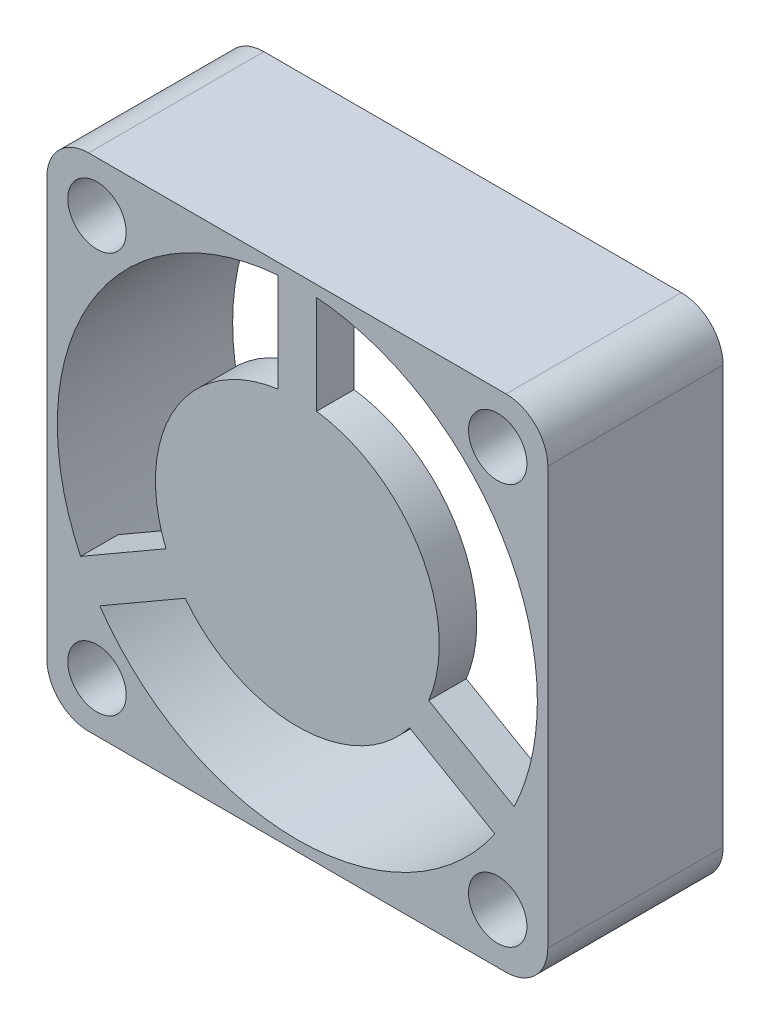
ISO-10303-21;
HEADER;
FILE_DESCRIPTION(('STEP AP214'),'2;1');
FILE_NAME('part.step','',(''),(''),'','','');
FILE_SCHEMA(('AUTOMOTIVE_DESIGN { 1 0 10303 214 1 1 1 1 }'));
ENDSEC;
DATA;
#1=APPLICATION_CONTEXT('core data for automotive mechanical design processes');
#2=APPLICATION_PROTOCOL_DEFINITION('international standard','automotive_design',2000,#1);
#3=PRODUCT_CONTEXT('',#1,'mechanical');
#4=PRODUCT('Part','Part','',(#3));
#5=PRODUCT_RELATED_PRODUCT_CATEGORY('part','',(#4));
#6=PRODUCT_DEFINITION_FORMATION('','',#4);
#7=PRODUCT_DEFINITION_CONTEXT('part definition',#1,'design');
#8=PRODUCT_DEFINITION('design','',#6,#7);
#9=PRODUCT_DEFINITION_SHAPE('','',#8);
#10=(LENGTH_UNIT() NAMED_UNIT(*) SI_UNIT(.MILLI.,.METRE.));
#11=(NAMED_UNIT(*) PLANE_ANGLE_UNIT() SI_UNIT($,.RADIAN.));
#12=(NAMED_UNIT(*) SI_UNIT($,.STERADIAN.) SOLID_ANGLE_UNIT());
#13=UNCERTAINTY_MEASURE_WITH_UNIT(LENGTH_MEASURE(1.E-05),#10,'distance_accuracy_value','');
#14=(GEOMETRIC_REPRESENTATION_CONTEXT(3) GLOBAL_UNCERTAINTY_ASSIGNED_CONTEXT((#13)) GLOBAL_UNIT_ASSIGNED_CONTEXT((#10,
#11,#12)) REPRESENTATION_CONTEXT('',''));
#15=CARTESIAN_POINT('',(0.,0.,0.));
#16=DIRECTION('',(0.,0.,1.));
#17=DIRECTION('',(1.,0.,0.));
#18=AXIS2_PLACEMENT_3D('',#15,#16,#17);
#19=CARTESIAN_POINT('',(0.,-15.5,3.31722847279162));
#20=DIRECTION('',(0.,-1.,0.));
#21=DIRECTION('',(0.,0.,-1.));
#22=AXIS2_PLACEMENT_3D('',#19,#20,#21);
#23=PLANE('',#22);
#24=DIRECTION('',(-1.,0.,0.));
#25=VECTOR('',#24,1.);
#26=CARTESIAN_POINT('',(-1.08409284439404,-15.5,5.9065637178719));
#27=LINE('',#26,#25);
#28=CARTESIAN_POINT('',(-0.473337044240907,-15.5,5.9065637178719));
#29=VERTEX_POINT('',#28);
#30=CARTESIAN_POINT('',(-1.69484864454716,-15.5,5.9065637178719));
#31=VERTEX_POINT('',#30);
#32=EDGE_CURVE('E225',#29,#31,#27,.T.);
#33=ORIENTED_EDGE('',*,*,#32,.F.);
#34=DIRECTION('',(0.,0.,1.));
#35=VECTOR('',#34,1.);
#36=CARTESIAN_POINT('',(-0.473337044240907,-15.5,3.89106664806604));
#37=LINE('',#36,#35);
#38=CARTESIAN_POINT('',(-0.473337044240907,-15.5,1.87556957826019));
#39=VERTEX_POINT('',#38);
#40=EDGE_CURVE('E204',#39,#29,#37,.T.);
#41=ORIENTED_EDGE('',*,*,#40,.F.);
#42=DIRECTION('',(-1.,0.,0.));
#43=VECTOR('',#42,1.);
#44=CARTESIAN_POINT('',(0.,-15.5,1.87556957826019));
#45=LINE('',#44,#43);
#46=CARTESIAN_POINT('',(0.473337044240907,-15.5,1.87556957826019));
#47=VERTEX_POINT('',#46);
#48=EDGE_CURVE('E210',#47,#39,#45,.T.);
#49=ORIENTED_EDGE('',*,*,#48,.F.);
#50=DIRECTION('',(0.,0.,1.));
#51=VECTOR('',#50,1.);
#52=CARTESIAN_POINT('',(0.473337044240907,-15.5,3.89106664806604));
#53=LINE('',#52,#51);
#54=CARTESIAN_POINT('',(0.473337044240907,-15.5,5.9065637178719));
#55=VERTEX_POINT('',#54);
#56=EDGE_CURVE('E381',#47,#55,#53,.T.);
#57=ORIENTED_EDGE('',*,*,#56,.T.);
#58=DIRECTION('',(1.,0.,0.));
#59=VECTOR('',#58,1.);
#60=CARTESIAN_POINT('',(1.08409284439404,-15.5,5.9065637178719));
#61=LINE('',#60,#59);
#62=CARTESIAN_POINT('',(1.69484864454716,-15.5,5.9065637178719));
#63=VERTEX_POINT('',#62);
#64=EDGE_CURVE('E387',#55,#63,#61,.T.);
#65=ORIENTED_EDGE('',*,*,#64,.T.);
#66=DIRECTION('',(-0.516547133213067,0.,0.856258757134408));
#67=VECTOR('',#66,1.);
#68=CARTESIAN_POINT('',(0.847424322273582,-15.5,7.31130386702716));
#69=LINE('',#68,#67);
#70=CARTESIAN_POINT('',(0.,-15.5,8.71604401618242));
#71=VERTEX_POINT('',#70);
#72=EDGE_CURVE('E393',#63,#71,#69,.T.);
#73=ORIENTED_EDGE('',*,*,#72,.T.);
#74=DIRECTION('',(0.516547133213067,0.,0.856258757134408));
#75=VECTOR('',#74,1.);
#76=CARTESIAN_POINT('',(-0.847424322273582,-15.5,7.31130386702716));
#77=LINE('',#76,#75);
#78=EDGE_CURVE('E396',#31,#71,#77,.T.);
#79=ORIENTED_EDGE('',*,*,#78,.F.);
#80=EDGE_LOOP('',(#33,#41,#49,#57,#65,#73,#79));
#81=FACE_BOUND('',#80,.T.);
#82=ADVANCED_FACE('F16',(#81),#23,.T.);
#83=CARTESIAN_POINT('',(0.,-15.5,1.87556957826019));
#84=DIRECTION('',(0.,0.,-1.));
#85=DIRECTION('',(-1.,0.,0.));
#86=AXIS2_PLACEMENT_3D('',#83,#84,#85);
#87=PLANE('',#86);
#88=ORIENTED_EDGE('',*,*,#48,.T.);
#89=DIRECTION('',(0.,1.,0.));
#90=VECTOR('',#89,1.);
#91=CARTESIAN_POINT('',(-0.473337044240907,-15.5,1.87556957826019));
#92=LINE('',#91,#90);
#93=CARTESIAN_POINT('',(-0.473337044240907,-15.,1.87556957826019));
#94=VERTEX_POINT('',#93);
#95=EDGE_CURVE('E213',#94,#39,#92,.F.);
#96=ORIENTED_EDGE('',*,*,#95,.F.);
#97=DIRECTION('',(1.,0.,0.));
#98=VECTOR('',#97,1.);
#99=CARTESIAN_POINT('',(0.,-15.,1.87556957826019));
#100=LINE('',#99,#98);
#101=CARTESIAN_POINT('',(0.473337044240907,-15.,1.87556957826019));
#102=VERTEX_POINT('',#101);
#103=EDGE_CURVE('E351',#102,#94,#100,.F.);
#104=ORIENTED_EDGE('',*,*,#103,.F.);
#105=DIRECTION('',(0.,1.,0.));
#106=VECTOR('',#105,1.);
#107=CARTESIAN_POINT('',(0.473337044240907,-15.5,1.87556957826019));
#108=LINE('',#107,#106);
#109=EDGE_CURVE('E215',#102,#47,#108,.F.);
#110=ORIENTED_EDGE('',*,*,#109,.T.);
#111=EDGE_LOOP('',(#88,#96,#104,#110));
#112=FACE_BOUND('',#111,.T.);
#113=ADVANCED_FACE('F211',(#112),#87,.T.);
#114=CARTESIAN_POINT('',(-0.473337044240907,-15.5,3.89106664806604));
#115=DIRECTION('',(-1.,0.,0.));
#116=DIRECTION('',(0.,0.,1.));
#117=AXIS2_PLACEMENT_3D('',#114,#115,#116);
#118=PLANE('',#117);
#119=ORIENTED_EDGE('',*,*,#40,.T.);
#120=DIRECTION('',(0.,1.,0.));
#121=VECTOR('',#120,1.);
#122=CARTESIAN_POINT('',(-0.473337044240907,-15.5,5.9065637178719));
#123=LINE('',#122,#121);
#124=CARTESIAN_POINT('',(-0.473337044240907,-15.,5.9065637178719));
#125=VERTEX_POINT('',#124);
#126=EDGE_CURVE('E226',#125,#29,#123,.F.);
#127=ORIENTED_EDGE('',*,*,#126,.F.);
#128=DIRECTION('',(0.,0.,-1.));
#129=VECTOR('',#128,1.);
#130=CARTESIAN_POINT('',(-0.473337044240907,-15.,10.5));
#131=LINE('',#130,#129);
#132=EDGE_CURVE('E221',#94,#125,#131,.F.);
#133=ORIENTED_EDGE('',*,*,#132,.F.);
#134=ORIENTED_EDGE('',*,*,#95,.T.);
#135=EDGE_LOOP('',(#119,#127,#133,#134));
#136=FACE_BOUND('',#135,.T.);
#137=ADVANCED_FACE('F220',(#136),#118,.T.);
#138=CARTESIAN_POINT('',(-1.08409284439404,-15.5,5.9065637178719));
#139=DIRECTION('',(0.,0.,-1.));
#140=DIRECTION('',(-1.,0.,0.));
#141=AXIS2_PLACEMENT_3D('',#138,#139,#140);
#142=PLANE('',#141);
#143=ORIENTED_EDGE('',*,*,#32,.T.);
#144=DIRECTION('',(0.,1.,0.));
#145=VECTOR('',#144,1.);
#146=CARTESIAN_POINT('',(-1.69484864454716,-15.5,5.9065637178719));
#147=LINE('',#146,#145);
#148=CARTESIAN_POINT('',(-1.69484864454716,-15.,5.9065637178719));
#149=VERTEX_POINT('',#148);
#150=EDGE_CURVE('E398',#149,#31,#147,.F.);
#151=ORIENTED_EDGE('',*,*,#150,.F.);
#152=DIRECTION('',(1.,0.,0.));
#153=VECTOR('',#152,1.);
#154=CARTESIAN_POINT('',(0.,-15.,5.9065637178719));
#155=LINE('',#154,#153);
#156=EDGE_CURVE('E348',#125,#149,#155,.F.);
#157=ORIENTED_EDGE('',*,*,#156,.F.);
#158=ORIENTED_EDGE('',*,*,#126,.T.);
#159=EDGE_LOOP('',(#143,#151,#157,#158));
#160=FACE_BOUND('',#159,.T.);
#161=ADVANCED_FACE('F402',(#160),#142,.T.);
#162=CARTESIAN_POINT('',(-0.847424322273582,-15.5,7.31130386702716));
#163=DIRECTION('',(-0.856258757134408,0.,0.516547133213067));
#164=DIRECTION('',(0.516547133213067,0.,0.856258757134408));
#165=AXIS2_PLACEMENT_3D('',#162,#163,#164);
#166=PLANE('',#165);
#167=ORIENTED_EDGE('',*,*,#78,.T.);
#168=DIRECTION('',(0.,1.,0.));
#169=VECTOR('',#168,1.);
#170=CARTESIAN_POINT('',(0.,-15.5,8.71604401618242));
#171=LINE('',#170,#169);
#172=CARTESIAN_POINT('',(0.,-15.,8.71604401618242));
#173=VERTEX_POINT('',#172);
#174=EDGE_CURVE('E390',#71,#173,#171,.T.);
#175=ORIENTED_EDGE('',*,*,#174,.T.);
#176=DIRECTION('',(0.516547133213066,0.,0.856258757134409));
#177=VECTOR('',#176,1.);
#178=CARTESIAN_POINT('',(-1.69484864454716,-15.,5.9065637178719));
#179=LINE('',#178,#177);
#180=EDGE_CURVE('E346',#149,#173,#179,.T.);
#181=ORIENTED_EDGE('',*,*,#180,.F.);
#182=ORIENTED_EDGE('',*,*,#150,.T.);
#183=EDGE_LOOP('',(#167,#175,#181,#182));
#184=FACE_BOUND('',#183,.T.);
#185=ADVANCED_FACE('F406',(#184),#166,.T.);
#186=CARTESIAN_POINT('',(0.847424322273582,-15.5,7.31130386702716));
#187=DIRECTION('',(-0.856258757134408,0.,-0.516547133213067));
#188=DIRECTION('',(-0.516547133213067,0.,0.856258757134408));
#189=AXIS2_PLACEMENT_3D('',#186,#187,#188);
#190=PLANE('',#189);
#191=ORIENTED_EDGE('',*,*,#174,.F.);
#192=ORIENTED_EDGE('',*,*,#72,.F.);
#193=DIRECTION('',(0.,1.,0.));
#194=VECTOR('',#193,1.);
#195=CARTESIAN_POINT('',(1.69484864454716,-15.5,5.9065637178719));
#196=LINE('',#195,#194);
#197=CARTESIAN_POINT('',(1.69484864454716,-15.,5.9065637178719));
#198=VERTEX_POINT('',#197);
#199=EDGE_CURVE('E384',#63,#198,#196,.T.);
#200=ORIENTED_EDGE('',*,*,#199,.T.);
#201=DIRECTION('',(0.516547133213066,0.,-0.856258757134409));
#202=VECTOR('',#201,1.);
#203=CARTESIAN_POINT('',(0.,-15.,8.71604401618242));
#204=LINE('',#203,#202);
#205=EDGE_CURVE('E344',#173,#198,#204,.T.);
#206=ORIENTED_EDGE('',*,*,#205,.F.);
#207=EDGE_LOOP('',(#191,#192,#200,#206));
#208=FACE_BOUND('',#207,.T.);
#209=ADVANCED_FACE('F410',(#208),#190,.F.);
#210=CARTESIAN_POINT('',(1.08409284439404,-15.5,5.9065637178719));
#211=DIRECTION('',(0.,0.,1.));
#212=DIRECTION('',(1.,0.,0.));
#213=AXIS2_PLACEMENT_3D('',#210,#211,#212);
#214=PLANE('',#213);
#215=ORIENTED_EDGE('',*,*,#199,.F.);
#216=ORIENTED_EDGE('',*,*,#64,.F.);
#217=DIRECTION('',(0.,1.,0.));
#218=VECTOR('',#217,1.);
#219=CARTESIAN_POINT('',(0.473337044240907,-15.5,5.9065637178719));
#220=LINE('',#219,#218);
#221=CARTESIAN_POINT('',(0.473337044240907,-15.,5.9065637178719));
#222=VERTEX_POINT('',#221);
#223=EDGE_CURVE('E365',#55,#222,#220,.T.);
#224=ORIENTED_EDGE('',*,*,#223,.T.);
#225=DIRECTION('',(1.,0.,0.));
#226=VECTOR('',#225,1.);
#227=CARTESIAN_POINT('',(0.,-15.,5.9065637178719));
#228=LINE('',#227,#226);
#229=EDGE_CURVE('E165',#198,#222,#228,.F.);
#230=ORIENTED_EDGE('',*,*,#229,.F.);
#231=EDGE_LOOP('',(#215,#216,#224,#230));
#232=FACE_BOUND('',#231,.T.);
#233=ADVANCED_FACE('F413',(#232),#214,.F.);
#234=CARTESIAN_POINT('',(0.473337044240907,-15.5,3.89106664806604));
#235=DIRECTION('',(-1.,0.,0.));
#236=DIRECTION('',(0.,0.,1.));
#237=AXIS2_PLACEMENT_3D('',#234,#235,#236);
#238=PLANE('',#237);
#239=ORIENTED_EDGE('',*,*,#223,.F.);
#240=ORIENTED_EDGE('',*,*,#56,.F.);
#241=ORIENTED_EDGE('',*,*,#109,.F.);
#242=DIRECTION('',(0.,0.,-1.));
#243=VECTOR('',#242,1.);
#244=CARTESIAN_POINT('',(0.473337044240907,-15.,10.5));
#245=LINE('',#244,#243);
#246=EDGE_CURVE('E341',#222,#102,#245,.T.);
#247=ORIENTED_EDGE('',*,*,#246,.F.);
#248=EDGE_LOOP('',(#239,#240,#241,#247));
#249=FACE_BOUND('',#248,.T.);
#250=ADVANCED_FACE('F417',(#249),#238,.F.);
#251=CARTESIAN_POINT('',(0.,0.,8.25));
#252=DIRECTION('',(0.,0.,-1.));
#253=DIRECTION('',(-1.,0.,0.));
#254=AXIS2_PLACEMENT_3D('',#251,#252,#253);
#255=CYLINDRICAL_SURFACE('',#254,8.5);
#256=CARTESIAN_POINT('',(0.,0.,8.25));
#257=DIRECTION('',(0.,0.,-1.));
#258=DIRECTION('',(-1.,0.,0.));
#259=AXIS2_PLACEMENT_3D('',#256,#257,#258);
#260=CIRCLE('',#259,8.5);
#261=CARTESIAN_POINT('',(-1.15,8.42184659086118,8.25));
#262=VERTEX_POINT('',#261);
#263=CARTESIAN_POINT('',(-7.86853309446115,-3.21499408107849,8.25));
#264=VERTEX_POINT('',#263);
#265=EDGE_CURVE('E299',#262,#264,#260,.F.);
#266=ORIENTED_EDGE('',*,*,#265,.T.);
#267=DIRECTION('',(0.,0.,1.));
#268=VECTOR('',#267,1.);
#269=CARTESIAN_POINT('',(-7.86853309446115,-3.21499408107848,8.25));
#270=LINE('',#269,#268);
#271=CARTESIAN_POINT('',(-7.86853309446115,-3.21499408107849,10.5));
#272=VERTEX_POINT('',#271);
#273=EDGE_CURVE('E375',#264,#272,#270,.T.);
#274=ORIENTED_EDGE('',*,*,#273,.T.);
#275=CARTESIAN_POINT('',(0.,0.,10.5));
#276=DIRECTION('',(0.,0.,-1.));
#277=DIRECTION('',(-1.,0.,0.));
#278=AXIS2_PLACEMENT_3D('',#275,#276,#277);
#279=CIRCLE('',#278,8.5);
#280=CARTESIAN_POINT('',(-1.15,8.42184659086118,10.5));
#281=VERTEX_POINT('',#280);
#282=EDGE_CURVE('E286',#281,#272,#279,.F.);
#283=ORIENTED_EDGE('',*,*,#282,.F.);
#284=DIRECTION('',(0.,0.,1.));
#285=VECTOR('',#284,1.);
#286=CARTESIAN_POINT('',(-1.15,8.42184659086118,8.25));
#287=LINE('',#286,#285);
#288=EDGE_CURVE('E378',#262,#281,#287,.T.);
#289=ORIENTED_EDGE('',*,*,#288,.F.);
#290=EDGE_LOOP('',(#266,#274,#283,#289));
#291=FACE_BOUND('',#290,.T.);
#292=ADVANCED_FACE('F517',(#291),#255,.T.);
#293=CARTESIAN_POINT('',(0.,0.,8.25));
#294=DIRECTION('',(0.,0.,-1.));
#295=DIRECTION('',(-1.,0.,0.));
#296=AXIS2_PLACEMENT_3D('',#293,#294,#295);
#297=CYLINDRICAL_SURFACE('',#296,8.5);
#298=CARTESIAN_POINT('',(0.,0.,8.25));
#299=DIRECTION('',(0.,0.,-1.));
#300=DIRECTION('',(-1.,0.,0.));
#301=AXIS2_PLACEMENT_3D('',#298,#299,#300);
#302=CIRCLE('',#301,8.5);
#303=CARTESIAN_POINT('',(-6.71853309446115,-5.2068525097827,8.25));
#304=VERTEX_POINT('',#303);
#305=CARTESIAN_POINT('',(6.71853309446115,-5.20685250978269,8.25));
#306=VERTEX_POINT('',#305);
#307=EDGE_CURVE('E294',#304,#306,#302,.F.);
#308=ORIENTED_EDGE('',*,*,#307,.T.);
#309=DIRECTION('',(0.,0.,1.));
#310=VECTOR('',#309,1.);
#311=CARTESIAN_POINT('',(6.71853309446115,-5.20685250978269,8.25));
#312=LINE('',#311,#310);
#313=CARTESIAN_POINT('',(6.71853309446115,-5.20685250978269,10.5));
#314=VERTEX_POINT('',#313);
#315=EDGE_CURVE('E368',#306,#314,#312,.T.);
#316=ORIENTED_EDGE('',*,*,#315,.T.);
#317=CARTESIAN_POINT('',(0.,0.,10.5));
#318=DIRECTION('',(0.,0.,-1.));
#319=DIRECTION('',(-1.,0.,0.));
#320=AXIS2_PLACEMENT_3D('',#317,#318,#319);
#321=CIRCLE('',#320,8.5);
#322=CARTESIAN_POINT('',(-6.71853309446115,-5.2068525097827,10.5));
#323=VERTEX_POINT('',#322);
#324=EDGE_CURVE('E282',#323,#314,#321,.F.);
#325=ORIENTED_EDGE('',*,*,#324,.F.);
#326=DIRECTION('',(0.,0.,1.));
#327=VECTOR('',#326,1.);
#328=CARTESIAN_POINT('',(-6.71853309446115,-5.20685250978269,8.25));
#329=LINE('',#328,#327);
#330=EDGE_CURVE('E373',#304,#323,#329,.T.);
#331=ORIENTED_EDGE('',*,*,#330,.F.);
#332=EDGE_LOOP('',(#308,#316,#325,#331));
#333=FACE_BOUND('',#332,.T.);
#334=ADVANCED_FACE('F589',(#333),#297,.T.);
#335=CARTESIAN_POINT('',(0.,0.,8.25));
#336=DIRECTION('',(0.,0.,-1.));
#337=DIRECTION('',(-1.,0.,0.));
#338=AXIS2_PLACEMENT_3D('',#335,#336,#337);
#339=CYLINDRICAL_SURFACE('',#338,8.5);
#340=CARTESIAN_POINT('',(0.,0.,8.25));
#341=DIRECTION('',(0.,0.,-1.));
#342=DIRECTION('',(-1.,0.,0.));
#343=AXIS2_PLACEMENT_3D('',#340,#341,#342);
#344=CIRCLE('',#343,8.5);
#345=CARTESIAN_POINT('',(7.86853309446115,-3.21499408107848,8.25));
#346=VERTEX_POINT('',#345);
#347=CARTESIAN_POINT('',(1.15,8.42184659086118,8.25));
#348=VERTEX_POINT('',#347);
#349=EDGE_CURVE('E290',#346,#348,#344,.F.);
#350=ORIENTED_EDGE('',*,*,#349,.T.);
#351=DIRECTION('',(0.,0.,1.));
#352=VECTOR('',#351,1.);
#353=CARTESIAN_POINT('',(1.15,8.42184659086118,8.25));
#354=LINE('',#353,#352);
#355=CARTESIAN_POINT('',(1.15,8.42184659086118,10.5));
#356=VERTEX_POINT('',#355);
#357=EDGE_CURVE('E369',#348,#356,#354,.T.);
#358=ORIENTED_EDGE('',*,*,#357,.T.);
#359=CARTESIAN_POINT('',(0.,0.,10.5));
#360=DIRECTION('',(0.,0.,-1.));
#361=DIRECTION('',(-1.,0.,0.));
#362=AXIS2_PLACEMENT_3D('',#359,#360,#361);
#363=CIRCLE('',#362,8.5);
#364=CARTESIAN_POINT('',(7.86853309446115,-3.21499408107848,10.5));
#365=VERTEX_POINT('',#364);
#366=EDGE_CURVE('E279',#365,#356,#363,.F.);
#367=ORIENTED_EDGE('',*,*,#366,.F.);
#368=DIRECTION('',(0.,0.,1.));
#369=VECTOR('',#368,1.);
#370=CARTESIAN_POINT('',(7.86853309446115,-3.21499408107848,8.25));
#371=LINE('',#370,#369);
#372=EDGE_CURVE('E366',#346,#365,#371,.T.);
#373=ORIENTED_EDGE('',*,*,#372,.F.);
#374=EDGE_LOOP('',(#350,#358,#367,#373));
#375=FACE_BOUND('',#374,.T.);
#376=ADVANCED_FACE('F595',(#375),#339,.T.);
#377=CARTESIAN_POINT('',(12.,-12.,10.5));
#378=DIRECTION('',(0.,0.,1.));
#379=DIRECTION('',(1.,0.,0.));
#380=AXIS2_PLACEMENT_3D('',#377,#378,#379);
#381=CYLINDRICAL_SURFACE('',#380,1.75);
#382=CARTESIAN_POINT('',(12.,-12.,0.));
#383=DIRECTION('',(0.,0.,1.));
#384=DIRECTION('',(1.,0.,0.));
#385=AXIS2_PLACEMENT_3D('',#382,#383,#384);
#386=CIRCLE('',#385,1.75);
#387=CARTESIAN_POINT('',(13.75,-12.,0.));
#388=VERTEX_POINT('',#387);
#389=EDGE_CURVE('E19',#388,#388,#386,.F.);
#390=ORIENTED_EDGE('',*,*,#389,.T.);
#391=EDGE_LOOP('',(#390));
#392=FACE_BOUND('',#391,.T.);
#393=CARTESIAN_POINT('',(12.,-12.,10.5));
#394=DIRECTION('',(0.,0.,1.));
#395=DIRECTION('',(1.,0.,0.));
#396=AXIS2_PLACEMENT_3D('',#393,#394,#395);
#397=CIRCLE('',#396,1.75);
#398=CARTESIAN_POINT('',(13.75,-12.,10.5));
#399=VERTEX_POINT('',#398);
#400=EDGE_CURVE('E276',#399,#399,#397,.F.);
#401=ORIENTED_EDGE('',*,*,#400,.F.);
#402=EDGE_LOOP('',(#401));
#403=FACE_BOUND('',#402,.T.);
#404=ADVANCED_FACE('F597',(#392,#403),#381,.F.);
#405=CARTESIAN_POINT('',(12.,12.,10.5));
#406=DIRECTION('',(0.,0.,1.));
#407=DIRECTION('',(1.,0.,0.));
#408=AXIS2_PLACEMENT_3D('',#405,#406,#407);
#409=CYLINDRICAL_SURFACE('',#408,1.75);
#410=CARTESIAN_POINT('',(12.,12.,0.));
#411=DIRECTION('',(0.,0.,1.));
#412=DIRECTION('',(1.,0.,0.));
#413=AXIS2_PLACEMENT_3D('',#410,#411,#412);
#414=CIRCLE('',#413,1.75);
#415=CARTESIAN_POINT('',(13.75,12.,0.));
#416=VERTEX_POINT('',#415);
#417=EDGE_CURVE('E324',#416,#416,#414,.F.);
#418=ORIENTED_EDGE('',*,*,#417,.T.);
#419=EDGE_LOOP('',(#418));
#420=FACE_BOUND('',#419,.T.);
#421=CARTESIAN_POINT('',(12.,12.,10.5));
#422=DIRECTION('',(0.,0.,1.));
#423=DIRECTION('',(1.,0.,0.));
#424=AXIS2_PLACEMENT_3D('',#421,#422,#423);
#425=CIRCLE('',#424,1.75);
#426=CARTESIAN_POINT('',(13.75,12.,10.5));
#427=VERTEX_POINT('',#426);
#428=EDGE_CURVE('E273',#427,#427,#425,.F.);
#429=ORIENTED_EDGE('',*,*,#428,.F.);
#430=EDGE_LOOP('',(#429));
#431=FACE_BOUND('',#430,.T.);
#432=ADVANCED_FACE('F497',(#420,#431),#409,.F.);
#433=CARTESIAN_POINT('',(-12.,-12.,10.5));
#434=DIRECTION('',(0.,0.,1.));
#435=DIRECTION('',(1.,0.,0.));
#436=AXIS2_PLACEMENT_3D('',#433,#434,#435);
#437=CYLINDRICAL_SURFACE('',#436,1.75);
#438=CARTESIAN_POINT('',(-12.,-12.,0.));
#439=DIRECTION('',(0.,0.,1.));
#440=DIRECTION('',(1.,0.,0.));
#441=AXIS2_PLACEMENT_3D('',#438,#439,#440);
#442=CIRCLE('',#441,1.75);
#443=CARTESIAN_POINT('',(-10.25,-12.,0.));
#444=VERTEX_POINT('',#443);
#445=EDGE_CURVE('E322',#444,#444,#442,.F.);
#446=ORIENTED_EDGE('',*,*,#445,.T.);
#447=EDGE_LOOP('',(#446));
#448=FACE_BOUND('',#447,.T.);
#449=CARTESIAN_POINT('',(-12.,-12.,10.5));
#450=DIRECTION('',(0.,0.,1.));
#451=DIRECTION('',(1.,0.,0.));
#452=AXIS2_PLACEMENT_3D('',#449,#450,#451);
#453=CIRCLE('',#452,1.75);
#454=CARTESIAN_POINT('',(-10.25,-12.,10.5));
#455=VERTEX_POINT('',#454);
#456=EDGE_CURVE('E270',#455,#455,#453,.F.);
#457=ORIENTED_EDGE('',*,*,#456,.F.);
#458=EDGE_LOOP('',(#457));
#459=FACE_BOUND('',#458,.T.);
#460=ADVANCED_FACE('F493',(#448,#459),#437,.F.);
#461=CARTESIAN_POINT('',(-12.,12.,10.5));
#462=DIRECTION('',(0.,0.,1.));
#463=DIRECTION('',(1.,0.,0.));
#464=AXIS2_PLACEMENT_3D('',#461,#462,#463);
#465=CYLINDRICAL_SURFACE('',#464,1.75);
#466=CARTESIAN_POINT('',(-12.,12.,0.));
#467=DIRECTION('',(0.,0.,1.));
#468=DIRECTION('',(1.,0.,0.));
#469=AXIS2_PLACEMENT_3D('',#466,#467,#468);
#470=CIRCLE('',#469,1.75);
#471=CARTESIAN_POINT('',(-10.25,12.,0.));
#472=VERTEX_POINT('',#471);
#473=EDGE_CURVE('E319',#472,#472,#470,.F.);
#474=ORIENTED_EDGE('',*,*,#473,.T.);
#475=EDGE_LOOP('',(#474));
#476=FACE_BOUND('',#475,.T.);
#477=CARTESIAN_POINT('',(-12.,12.,10.5));
#478=DIRECTION('',(0.,0.,1.));
#479=DIRECTION('',(1.,0.,0.));
#480=AXIS2_PLACEMENT_3D('',#477,#478,#479);
#481=CIRCLE('',#480,1.75);
#482=CARTESIAN_POINT('',(-10.25,12.,10.5));
#483=VERTEX_POINT('',#482);
#484=EDGE_CURVE('E267',#483,#483,#481,.F.);
#485=ORIENTED_EDGE('',*,*,#484,.F.);
#486=EDGE_LOOP('',(#485));
#487=FACE_BOUND('',#486,.T.);
#488=ADVANCED_FACE('F496',(#476,#487),#465,.F.);
#489=CARTESIAN_POINT('',(15.,0.,10.5));
#490=DIRECTION('',(1.,0.,0.));
#491=DIRECTION('',(0.,1.,0.));
#492=AXIS2_PLACEMENT_3D('',#489,#490,#491);
#493=PLANE('',#492);
#494=DIRECTION('',(0.,1.,0.));
#495=VECTOR('',#494,1.);
#496=CARTESIAN_POINT('',(15.,0.,10.5));
#497=LINE('',#496,#495);
#498=CARTESIAN_POINT('',(15.,-12.5,10.5));
#499=VERTEX_POINT('',#498);
#500=CARTESIAN_POINT('',(15.,12.5,10.5));
#501=VERTEX_POINT('',#500);
#502=EDGE_CURVE('E266',#499,#501,#497,.T.);
#503=ORIENTED_EDGE('',*,*,#502,.F.);
#504=DIRECTION('',(0.,0.,1.));
#505=VECTOR('',#504,1.);
#506=CARTESIAN_POINT('',(15.,-12.5,10.5));
#507=LINE('',#506,#505);
#508=CARTESIAN_POINT('',(15.,-12.5,0.));
#509=VERTEX_POINT('',#508);
#510=EDGE_CURVE('E329',#509,#499,#507,.T.);
#511=ORIENTED_EDGE('',*,*,#510,.F.);
#512=DIRECTION('',(0.,1.,0.));
#513=VECTOR('',#512,1.);
#514=CARTESIAN_POINT('',(15.,0.,0.));
#515=LINE('',#514,#513);
#516=CARTESIAN_POINT('',(15.,12.5,0.));
#517=VERTEX_POINT('',#516);
#518=EDGE_CURVE('E308',#509,#517,#515,.T.);
#519=ORIENTED_EDGE('',*,*,#518,.T.);
#520=DIRECTION('',(0.,0.,-1.));
#521=VECTOR('',#520,1.);
#522=CARTESIAN_POINT('',(15.,12.5,10.5));
#523=LINE('',#522,#521);
#524=EDGE_CURVE('E363',#501,#517,#523,.T.);
#525=ORIENTED_EDGE('',*,*,#524,.F.);
#526=EDGE_LOOP('',(#503,#511,#519,#525));
#527=FACE_BOUND('',#526,.T.);
#528=ADVANCED_FACE('F574',(#527),#493,.T.);
#529=CARTESIAN_POINT('',(12.5,12.5,10.5));
#530=DIRECTION('',(0.,0.,-1.));
#531=DIRECTION('',(-1.,0.,0.));
#532=AXIS2_PLACEMENT_3D('',#529,#530,#531);
#533=CYLINDRICAL_SURFACE('',#532,2.5);
#534=CARTESIAN_POINT('',(12.5,12.5,0.));
#535=DIRECTION('',(0.,0.,-1.));
#536=DIRECTION('',(-1.,0.,0.));
#537=AXIS2_PLACEMENT_3D('',#534,#535,#536);
#538=CIRCLE('',#537,2.5);
#539=CARTESIAN_POINT('',(12.5,15.,0.));
#540=VERTEX_POINT('',#539);
#541=EDGE_CURVE('E304',#517,#540,#538,.F.);
#542=ORIENTED_EDGE('',*,*,#541,.T.);
#543=DIRECTION('',(0.,0.,-1.));
#544=VECTOR('',#543,1.);
#545=CARTESIAN_POINT('',(12.5,15.,10.5));
#546=LINE('',#545,#544);
#547=CARTESIAN_POINT('',(12.5,15.,10.5));
#548=VERTEX_POINT('',#547);
#549=EDGE_CURVE('E360',#540,#548,#546,.F.);
#550=ORIENTED_EDGE('',*,*,#549,.T.);
#551=CARTESIAN_POINT('',(12.5,12.5,10.5));
#552=DIRECTION('',(0.,0.,-1.));
#553=DIRECTION('',(-1.,0.,0.));
#554=AXIS2_PLACEMENT_3D('',#551,#552,#553);
#555=CIRCLE('',#554,2.5);
#556=EDGE_CURVE('E264',#501,#548,#555,.F.);
#557=ORIENTED_EDGE('',*,*,#556,.F.);
#558=ORIENTED_EDGE('',*,*,#524,.T.);
#559=EDGE_LOOP('',(#542,#550,#557,#558));
#560=FACE_BOUND('',#559,.T.);
#561=ADVANCED_FACE('F570',(#560),#533,.T.);
#562=CARTESIAN_POINT('',(2.5601752889007,15.,10.5));
#563=DIRECTION('',(0.,-1.,0.));
#564=DIRECTION('',(0.,0.,-1.));
#565=AXIS2_PLACEMENT_3D('',#562,#563,#564);
#566=PLANE('',#565);
#567=ORIENTED_EDGE('',*,*,#549,.F.);
#568=DIRECTION('',(1.,0.,0.));
#569=VECTOR('',#568,1.);
#570=CARTESIAN_POINT('',(0.,15.,0.));
#571=LINE('',#570,#569);
#572=CARTESIAN_POINT('',(-12.5,15.,0.));
#573=VERTEX_POINT('',#572);
#574=EDGE_CURVE('E307',#540,#573,#571,.F.);
#575=ORIENTED_EDGE('',*,*,#574,.T.);
#576=DIRECTION('',(0.,0.,1.));
#577=VECTOR('',#576,1.);
#578=CARTESIAN_POINT('',(-12.5,15.,10.5));
#579=LINE('',#578,#577);
#580=CARTESIAN_POINT('',(-12.5,15.,10.5));
#581=VERTEX_POINT('',#580);
#582=EDGE_CURVE('E155',#581,#573,#579,.F.);
#583=ORIENTED_EDGE('',*,*,#582,.F.);
#584=DIRECTION('',(1.,0.,0.));
#585=VECTOR('',#584,1.);
#586=CARTESIAN_POINT('',(0.,15.,10.5));
#587=LINE('',#586,#585);
#588=EDGE_CURVE('E263',#548,#581,#587,.F.);
#589=ORIENTED_EDGE('',*,*,#588,.F.);
#590=EDGE_LOOP('',(#567,#575,#583,#589));
#591=FACE_BOUND('',#590,.T.);
#592=ADVANCED_FACE('F568',(#591),#566,.F.);
#593=CARTESIAN_POINT('',(-12.5,12.5,10.5));
#594=DIRECTION('',(0.,0.,1.));
#595=DIRECTION('',(1.,0.,0.));
#596=AXIS2_PLACEMENT_3D('',#593,#594,#595);
#597=CYLINDRICAL_SURFACE('',#596,2.5);
#598=CARTESIAN_POINT('',(-12.5,12.5,0.));
#599=DIRECTION('',(0.,0.,1.));
#600=DIRECTION('',(1.,0.,0.));
#601=AXIS2_PLACEMENT_3D('',#598,#599,#600);
#602=CIRCLE('',#601,2.5);
#603=CARTESIAN_POINT('',(-15.,12.5,0.));
#604=VERTEX_POINT('',#603);
#605=EDGE_CURVE('E317',#573,#604,#602,.T.);
#606=ORIENTED_EDGE('',*,*,#605,.T.);
#607=DIRECTION('',(0.,0.,1.));
#608=VECTOR('',#607,1.);
#609=CARTESIAN_POINT('',(-15.,12.5,10.5));
#610=LINE('',#609,#608);
#611=CARTESIAN_POINT('',(-15.,12.5,10.5));
#612=VERTEX_POINT('',#611);
#613=EDGE_CURVE('E356',#604,#612,#610,.T.);
#614=ORIENTED_EDGE('',*,*,#613,.T.);
#615=CARTESIAN_POINT('',(-12.5,12.5,10.5));
#616=DIRECTION('',(0.,0.,1.));
#617=DIRECTION('',(1.,0.,0.));
#618=AXIS2_PLACEMENT_3D('',#615,#616,#617);
#619=CIRCLE('',#618,2.5);
#620=EDGE_CURVE('E261',#581,#612,#619,.T.);
#621=ORIENTED_EDGE('',*,*,#620,.F.);
#622=ORIENTED_EDGE('',*,*,#582,.T.);
#623=EDGE_LOOP('',(#606,#614,#621,#622));
#624=FACE_BOUND('',#623,.T.);
#625=ADVANCED_FACE('F562',(#624),#597,.T.);
#626=CARTESIAN_POINT('',(-15.,0.,10.5));
#627=DIRECTION('',(1.,0.,0.));
#628=DIRECTION('',(0.,1.,0.));
#629=AXIS2_PLACEMENT_3D('',#626,#627,#628);
#630=PLANE('',#629);
#631=ORIENTED_EDGE('',*,*,#613,.F.);
#632=DIRECTION('',(0.,1.,0.));
#633=VECTOR('',#632,1.);
#634=CARTESIAN_POINT('',(-15.,0.,0.));
#635=LINE('',#634,#633);
#636=CARTESIAN_POINT('',(-15.,-12.5,0.));
#637=VERTEX_POINT('',#636);
#638=EDGE_CURVE('E316',#604,#637,#635,.F.);
#639=ORIENTED_EDGE('',*,*,#638,.T.);
#640=DIRECTION('',(0.,0.,-1.));
#641=VECTOR('',#640,1.);
#642=CARTESIAN_POINT('',(-15.,-12.5,10.5));
#643=LINE('',#642,#641);
#644=CARTESIAN_POINT('',(-15.,-12.5,10.5));
#645=VERTEX_POINT('',#644);
#646=EDGE_CURVE('E353',#645,#637,#643,.T.);
#647=ORIENTED_EDGE('',*,*,#646,.F.);
#648=DIRECTION('',(0.,1.,0.));
#649=VECTOR('',#648,1.);
#650=CARTESIAN_POINT('',(-15.,0.,10.5));
#651=LINE('',#650,#649);
#652=EDGE_CURVE('E260',#612,#645,#651,.F.);
#653=ORIENTED_EDGE('',*,*,#652,.F.);
#654=EDGE_LOOP('',(#631,#639,#647,#653));
#655=FACE_BOUND('',#654,.T.);
#656=ADVANCED_FACE('F431',(#655),#630,.F.);
#657=CARTESIAN_POINT('',(-12.5,-12.5,10.5));
#658=DIRECTION('',(0.,0.,-1.));
#659=DIRECTION('',(-1.,0.,0.));
#660=AXIS2_PLACEMENT_3D('',#657,#658,#659);
#661=CYLINDRICAL_SURFACE('',#660,2.5);
#662=CARTESIAN_POINT('',(-12.5,-12.5,0.));
#663=DIRECTION('',(0.,0.,-1.));
#664=DIRECTION('',(-1.,0.,0.));
#665=AXIS2_PLACEMENT_3D('',#662,#663,#664);
#666=CIRCLE('',#665,2.5);
#667=CARTESIAN_POINT('',(-12.5,-15.,0.));
#668=VERTEX_POINT('',#667);
#669=EDGE_CURVE('E313',#637,#668,#666,.F.);
#670=ORIENTED_EDGE('',*,*,#669,.T.);
#671=DIRECTION('',(0.,0.,-1.));
#672=VECTOR('',#671,1.);
#673=CARTESIAN_POINT('',(-12.5,-15.,10.5));
#674=LINE('',#673,#672);
#675=CARTESIAN_POINT('',(-12.5,-15.,10.5));
#676=VERTEX_POINT('',#675);
#677=EDGE_CURVE('E336',#676,#668,#674,.T.);
#678=ORIENTED_EDGE('',*,*,#677,.F.);
#679=CARTESIAN_POINT('',(-12.5,-12.5,10.5));
#680=DIRECTION('',(0.,0.,-1.));
#681=DIRECTION('',(-1.,0.,0.));
#682=AXIS2_PLACEMENT_3D('',#679,#680,#681);
#683=CIRCLE('',#682,2.5);
#684=EDGE_CURVE('E258',#645,#676,#683,.F.);
#685=ORIENTED_EDGE('',*,*,#684,.F.);
#686=ORIENTED_EDGE('',*,*,#646,.T.);
#687=EDGE_LOOP('',(#670,#678,#685,#686));
#688=FACE_BOUND('',#687,.T.);
#689=ADVANCED_FACE('F421',(#688),#661,.T.);
#690=CARTESIAN_POINT('',(0.,-15.,10.5));
#691=DIRECTION('',(0.,-1.,0.));
#692=DIRECTION('',(0.,0.,-1.));
#693=AXIS2_PLACEMENT_3D('',#690,#691,#692);
#694=PLANE('',#693);
#695=DIRECTION('',(1.,0.,0.));
#696=VECTOR('',#695,1.);
#697=CARTESIAN_POINT('',(0.,-15.,0.));
#698=LINE('',#697,#696);
#699=CARTESIAN_POINT('',(12.5,-15.,0.));
#700=VERTEX_POINT('',#699);
#701=EDGE_CURVE('E312',#668,#700,#698,.T.);
#702=ORIENTED_EDGE('',*,*,#701,.T.);
#703=DIRECTION('',(0.,0.,1.));
#704=VECTOR('',#703,1.);
#705=CARTESIAN_POINT('',(12.5,-15.,10.5));
#706=LINE('',#705,#704);
#707=CARTESIAN_POINT('',(12.5,-15.,10.5));
#708=VERTEX_POINT('',#707);
#709=EDGE_CURVE('E332',#708,#700,#706,.F.);
#710=ORIENTED_EDGE('',*,*,#709,.F.);
#711=DIRECTION('',(1.,0.,0.));
#712=VECTOR('',#711,1.);
#713=CARTESIAN_POINT('',(0.,-15.,10.5));
#714=LINE('',#713,#712);
#715=EDGE_CURVE('E257',#676,#708,#714,.T.);
#716=ORIENTED_EDGE('',*,*,#715,.F.);
#717=ORIENTED_EDGE('',*,*,#677,.T.);
#718=EDGE_LOOP('',(#702,#710,#716,#717));
#719=FACE_BOUND('',#718,.T.);
#720=ORIENTED_EDGE('',*,*,#229,.T.);
#721=ORIENTED_EDGE('',*,*,#246,.T.);
#722=ORIENTED_EDGE('',*,*,#103,.T.);
#723=ORIENTED_EDGE('',*,*,#132,.T.);
#724=ORIENTED_EDGE('',*,*,#156,.T.);
#725=ORIENTED_EDGE('',*,*,#180,.T.);
#726=ORIENTED_EDGE('',*,*,#205,.T.);
#727=EDGE_LOOP('',(#720,#721,#722,#723,#724,#725,#726));
#728=FACE_BOUND('',#727,.T.);
#729=ADVANCED_FACE('F418',(#719,#728),#694,.T.);
#730=CARTESIAN_POINT('',(12.5,-12.5,10.5));
#731=DIRECTION('',(0.,0.,1.));
#732=DIRECTION('',(1.,0.,0.));
#733=AXIS2_PLACEMENT_3D('',#730,#731,#732);
#734=CYLINDRICAL_SURFACE('',#733,2.5);
#735=CARTESIAN_POINT('',(12.5,-12.5,0.));
#736=DIRECTION('',(0.,0.,1.));
#737=DIRECTION('',(1.,0.,0.));
#738=AXIS2_PLACEMENT_3D('',#735,#736,#737);
#739=CIRCLE('',#738,2.5);
#740=EDGE_CURVE('E309',#700,#509,#739,.T.);
#741=ORIENTED_EDGE('',*,*,#740,.T.);
#742=ORIENTED_EDGE('',*,*,#510,.T.);
#743=CARTESIAN_POINT('',(12.5,-12.5,10.5));
#744=DIRECTION('',(0.,0.,1.));
#745=DIRECTION('',(1.,0.,0.));
#746=AXIS2_PLACEMENT_3D('',#743,#744,#745);
#747=CIRCLE('',#746,2.5);
#748=EDGE_CURVE('E254',#708,#499,#747,.T.);
#749=ORIENTED_EDGE('',*,*,#748,.F.);
#750=ORIENTED_EDGE('',*,*,#709,.T.);
#751=EDGE_LOOP('',(#741,#742,#749,#750));
#752=FACE_BOUND('',#751,.T.);
#753=ADVANCED_FACE('F420',(#752),#734,.T.);
#754=CARTESIAN_POINT('',(0.,0.,0.));
#755=DIRECTION('',(0.,0.,1.));
#756=DIRECTION('',(1.,0.,0.));
#757=AXIS2_PLACEMENT_3D('',#754,#755,#756);
#758=PLANE('',#757);
#759=ORIENTED_EDGE('',*,*,#541,.F.);
#760=ORIENTED_EDGE('',*,*,#518,.F.);
#761=ORIENTED_EDGE('',*,*,#740,.F.);
#762=ORIENTED_EDGE('',*,*,#701,.F.);
#763=ORIENTED_EDGE('',*,*,#669,.F.);
#764=ORIENTED_EDGE('',*,*,#638,.F.);
#765=ORIENTED_EDGE('',*,*,#605,.F.);
#766=ORIENTED_EDGE('',*,*,#574,.F.);
#767=EDGE_LOOP('',(#759,#760,#761,#762,#763,#764,#765,#766));
#768=FACE_BOUND('',#767,.T.);
#769=ORIENTED_EDGE('',*,*,#473,.F.);
#770=EDGE_LOOP('',(#769));
#771=FACE_BOUND('',#770,.T.);
#772=ORIENTED_EDGE('',*,*,#445,.F.);
#773=EDGE_LOOP('',(#772));
#774=FACE_BOUND('',#773,.T.);
#775=ORIENTED_EDGE('',*,*,#417,.F.);
#776=EDGE_LOOP('',(#775));
#777=FACE_BOUND('',#776,.T.);
#778=ORIENTED_EDGE('',*,*,#389,.F.);
#779=EDGE_LOOP('',(#778));
#780=FACE_BOUND('',#779,.T.);
#781=CARTESIAN_POINT('',(0.,0.,0.));
#782=DIRECTION('',(0.,0.,1.));
#783=DIRECTION('',(1.,0.,0.));
#784=AXIS2_PLACEMENT_3D('',#781,#782,#783);
#785=CIRCLE('',#784,14.375);
#786=CARTESIAN_POINT('',(14.375,0.,0.));
#787=VERTEX_POINT('',#786);
#788=EDGE_CURVE('E251',#787,#787,#785,.T.);
#789=ORIENTED_EDGE('',*,*,#788,.T.);
#790=EDGE_LOOP('',(#789));
#791=FACE_BOUND('',#790,.T.);
#792=ADVANCED_FACE('F429',(#768,#771,#774,#777,#780,#791),#758,.F.);
#793=CARTESIAN_POINT('',(7.05285441881072,-2.74406177811947,8.25));
#794=DIRECTION('',(0.5,0.866025403784439,0.));
#795=DIRECTION('',(-0.866025403784439,0.5,0.));
#796=AXIS2_PLACEMENT_3D('',#793,#794,#795);
#797=PLANE('',#796);
#798=DIRECTION('',(-0.86602540378444,0.499999999999997,0.));
#799=VECTOR('',#798,1.);
#800=CARTESIAN_POINT('',(12.9842140665717,-6.16853386741473,8.25));
#801=LINE('',#800,#799);
#802=CARTESIAN_POINT('',(12.9842140665717,-6.16853386741472,8.25));
#803=VERTEX_POINT('',#802);
#804=EDGE_CURVE('E293',#803,#346,#801,.T.);
#805=ORIENTED_EDGE('',*,*,#804,.T.);
#806=ORIENTED_EDGE('',*,*,#372,.T.);
#807=DIRECTION('',(-0.86602540378444,0.499999999999997,0.));
#808=VECTOR('',#807,1.);
#809=CARTESIAN_POINT('',(12.9842140665717,-6.16853386741473,10.5));
#810=LINE('',#809,#808);
#811=CARTESIAN_POINT('',(12.9842140665717,-6.16853386741472,10.5));
#812=VERTEX_POINT('',#811);
#813=EDGE_CURVE('E281',#812,#365,#810,.T.);
#814=ORIENTED_EDGE('',*,*,#813,.F.);
#815=DIRECTION('',(0.,0.,1.));
#816=VECTOR('',#815,1.);
#817=CARTESIAN_POINT('',(12.9842140665717,-6.16853386741472,10.5));
#818=LINE('',#817,#816);
#819=EDGE_CURVE('E250',#812,#803,#818,.F.);
#820=ORIENTED_EDGE('',*,*,#819,.T.);
#821=EDGE_LOOP('',(#805,#806,#814,#820));
#822=FACE_BOUND('',#821,.T.);
#823=ADVANCED_FACE('F471',(#822),#797,.T.);
#824=CARTESIAN_POINT('',(5.90285441881072,-4.73592020682368,8.25));
#825=DIRECTION('',(0.5,0.866025403784439,0.));
#826=DIRECTION('',(-0.866025403784439,0.5,0.));
#827=AXIS2_PLACEMENT_3D('',#824,#825,#826);
#828=PLANE('',#827);
#829=DIRECTION('',(0.86602540378444,-0.499999999999997,0.));
#830=VECTOR('',#829,1.);
#831=CARTESIAN_POINT('',(6.71853309446115,-5.20685250978269,10.5));
#832=LINE('',#831,#830);
#833=CARTESIAN_POINT('',(11.8342140665717,-8.16039229611893,10.5));
#834=VERTEX_POINT('',#833);
#835=EDGE_CURVE('E284',#314,#834,#832,.T.);
#836=ORIENTED_EDGE('',*,*,#835,.F.);
#837=ORIENTED_EDGE('',*,*,#315,.F.);
#838=DIRECTION('',(0.86602540378444,-0.499999999999997,0.));
#839=VECTOR('',#838,1.);
#840=CARTESIAN_POINT('',(6.71853309446115,-5.20685250978269,8.25));
#841=LINE('',#840,#839);
#842=CARTESIAN_POINT('',(11.8342140665717,-8.16039229611893,8.25));
#843=VERTEX_POINT('',#842);
#844=EDGE_CURVE('E297',#306,#843,#841,.T.);
#845=ORIENTED_EDGE('',*,*,#844,.T.);
#846=DIRECTION('',(0.,0.,1.));
#847=VECTOR('',#846,1.);
#848=CARTESIAN_POINT('',(11.8342140665717,-8.16039229611893,10.5));
#849=LINE('',#848,#847);
#850=EDGE_CURVE('E246',#843,#834,#849,.T.);
#851=ORIENTED_EDGE('',*,*,#850,.T.);
#852=EDGE_LOOP('',(#836,#837,#845,#851));
#853=FACE_BOUND('',#852,.T.);
#854=ADVANCED_FACE('F467',(#853),#828,.F.);
#855=CARTESIAN_POINT('',(-5.90285441881072,-4.73592020682368,8.25));
#856=DIRECTION('',(0.5,-0.866025403784438,0.));
#857=DIRECTION('',(0.866025403784438,0.5,0.));
#858=AXIS2_PLACEMENT_3D('',#855,#856,#857);
#859=PLANE('',#858);
#860=DIRECTION('',(0.86602540378444,0.499999999999997,0.));
#861=VECTOR('',#860,1.);
#862=CARTESIAN_POINT('',(-11.8342140665717,-8.16039229611895,8.25));
#863=LINE('',#862,#861);
#864=CARTESIAN_POINT('',(-11.8342140665717,-8.16039229611893,8.25));
#865=VERTEX_POINT('',#864);
#866=EDGE_CURVE('E298',#865,#304,#863,.T.);
#867=ORIENTED_EDGE('',*,*,#866,.T.);
#868=ORIENTED_EDGE('',*,*,#330,.T.);
#869=DIRECTION('',(0.86602540378444,0.499999999999997,0.));
#870=VECTOR('',#869,1.);
#871=CARTESIAN_POINT('',(-11.8342140665717,-8.16039229611895,10.5));
#872=LINE('',#871,#870);
#873=CARTESIAN_POINT('',(-11.8342140665717,-8.16039229611893,10.5));
#874=VERTEX_POINT('',#873);
#875=EDGE_CURVE('E285',#874,#323,#872,.T.);
#876=ORIENTED_EDGE('',*,*,#875,.F.);
#877=DIRECTION('',(0.,0.,1.));
#878=VECTOR('',#877,1.);
#879=CARTESIAN_POINT('',(-11.8342140665717,-8.16039229611893,10.5));
#880=LINE('',#879,#878);
#881=EDGE_CURVE('E242',#874,#865,#880,.F.);
#882=ORIENTED_EDGE('',*,*,#881,.T.);
#883=EDGE_LOOP('',(#867,#868,#876,#882));
#884=FACE_BOUND('',#883,.T.);
#885=ADVANCED_FACE('F463',(#884),#859,.T.);
#886=CARTESIAN_POINT('',(-7.05285441881072,-2.74406177811947,8.25));
#887=DIRECTION('',(0.5,-0.866025403784438,0.));
#888=DIRECTION('',(0.866025403784438,0.5,0.));
#889=AXIS2_PLACEMENT_3D('',#886,#887,#888);
#890=PLANE('',#889);
#891=DIRECTION('',(-0.86602540378444,-0.499999999999997,0.));
#892=VECTOR('',#891,1.);
#893=CARTESIAN_POINT('',(-7.86853309446115,-3.21499408107849,10.5));
#894=LINE('',#893,#892);
#895=CARTESIAN_POINT('',(-12.9842140665717,-6.16853386741472,10.5));
#896=VERTEX_POINT('',#895);
#897=EDGE_CURVE('E288',#272,#896,#894,.T.);
#898=ORIENTED_EDGE('',*,*,#897,.F.);
#899=ORIENTED_EDGE('',*,*,#273,.F.);
#900=DIRECTION('',(-0.86602540378444,-0.499999999999997,0.));
#901=VECTOR('',#900,1.);
#902=CARTESIAN_POINT('',(-7.86853309446115,-3.21499408107849,8.25));
#903=LINE('',#902,#901);
#904=CARTESIAN_POINT('',(-12.9842140665717,-6.16853386741472,8.25));
#905=VERTEX_POINT('',#904);
#906=EDGE_CURVE('E302',#264,#905,#903,.T.);
#907=ORIENTED_EDGE('',*,*,#906,.T.);
#908=DIRECTION('',(0.,0.,1.));
#909=VECTOR('',#908,1.);
#910=CARTESIAN_POINT('',(-12.9842140665717,-6.16853386741472,10.5));
#911=LINE('',#910,#909);
#912=EDGE_CURVE('E238',#905,#896,#911,.T.);
#913=ORIENTED_EDGE('',*,*,#912,.T.);
#914=EDGE_LOOP('',(#898,#899,#907,#913));
#915=FACE_BOUND('',#914,.T.);
#916=ADVANCED_FACE('F459',(#915),#890,.F.);
#917=CARTESIAN_POINT('',(-1.15,7.47998198494315,8.25));
#918=DIRECTION('',(-1.,0.,0.));
#919=DIRECTION('',(0.,0.,1.));
#920=AXIS2_PLACEMENT_3D('',#917,#918,#919);
#921=PLANE('',#920);
#922=DIRECTION('',(0.,1.,0.));
#923=VECTOR('',#922,1.);
#924=CARTESIAN_POINT('',(-1.15,0.,8.25));
#925=LINE('',#924,#923);
#926=CARTESIAN_POINT('',(-1.15,14.3289261635337,8.25));
#927=VERTEX_POINT('',#926);
#928=EDGE_CURVE('E303',#927,#262,#925,.F.);
#929=ORIENTED_EDGE('',*,*,#928,.T.);
#930=ORIENTED_EDGE('',*,*,#288,.T.);
#931=DIRECTION('',(0.,1.,0.));
#932=VECTOR('',#931,1.);
#933=CARTESIAN_POINT('',(-1.15,0.,10.5));
#934=LINE('',#933,#932);
#935=CARTESIAN_POINT('',(-1.15,14.3289261635337,10.5));
#936=VERTEX_POINT('',#935);
#937=EDGE_CURVE('E289',#936,#281,#934,.F.);
#938=ORIENTED_EDGE('',*,*,#937,.F.);
#939=DIRECTION('',(0.,0.,1.));
#940=VECTOR('',#939,1.);
#941=CARTESIAN_POINT('',(-1.15,14.3289261635337,10.5));
#942=LINE('',#941,#940);
#943=EDGE_CURVE('E234',#936,#927,#942,.F.);
#944=ORIENTED_EDGE('',*,*,#943,.T.);
#945=EDGE_LOOP('',(#929,#930,#938,#944));
#946=FACE_BOUND('',#945,.T.);
#947=ADVANCED_FACE('F455',(#946),#921,.T.);
#948=CARTESIAN_POINT('',(0.,0.,8.25));
#949=DIRECTION('',(0.,0.,1.));
#950=DIRECTION('',(1.,0.,0.));
#951=AXIS2_PLACEMENT_3D('',#948,#949,#950);
#952=PLANE('',#951);
#953=DIRECTION('',(0.,1.,0.));
#954=VECTOR('',#953,1.);
#955=CARTESIAN_POINT('',(1.15,7.47998198494315,8.25));
#956=LINE('',#955,#954);
#957=CARTESIAN_POINT('',(1.15,14.3289261635337,8.25));
#958=VERTEX_POINT('',#957);
#959=EDGE_CURVE('E292',#958,#348,#956,.F.);
#960=ORIENTED_EDGE('',*,*,#959,.T.);
#961=ORIENTED_EDGE('',*,*,#349,.F.);
#962=ORIENTED_EDGE('',*,*,#804,.F.);
#963=CARTESIAN_POINT('',(0.,0.,8.25));
#964=DIRECTION('',(0.,0.,1.));
#965=DIRECTION('',(1.,0.,0.));
#966=AXIS2_PLACEMENT_3D('',#963,#964,#965);
#967=CIRCLE('',#966,14.375);
#968=EDGE_CURVE('E247',#803,#843,#967,.F.);
#969=ORIENTED_EDGE('',*,*,#968,.T.);
#970=ORIENTED_EDGE('',*,*,#844,.F.);
#971=ORIENTED_EDGE('',*,*,#307,.F.);
#972=ORIENTED_EDGE('',*,*,#866,.F.);
#973=CARTESIAN_POINT('',(0.,0.,8.25));
#974=DIRECTION('',(0.,0.,1.));
#975=DIRECTION('',(1.,0.,0.));
#976=AXIS2_PLACEMENT_3D('',#973,#974,#975);
#977=CIRCLE('',#976,14.375);
#978=EDGE_CURVE('E239',#865,#905,#977,.F.);
#979=ORIENTED_EDGE('',*,*,#978,.T.);
#980=ORIENTED_EDGE('',*,*,#906,.F.);
#981=ORIENTED_EDGE('',*,*,#265,.F.);
#982=ORIENTED_EDGE('',*,*,#928,.F.);
#983=CARTESIAN_POINT('',(0.,0.,8.25));
#984=DIRECTION('',(0.,0.,1.));
#985=DIRECTION('',(1.,0.,0.));
#986=AXIS2_PLACEMENT_3D('',#983,#984,#985);
#987=CIRCLE('',#986,14.375);
#988=EDGE_CURVE('E231',#927,#958,#987,.F.);
#989=ORIENTED_EDGE('',*,*,#988,.T.);
#990=EDGE_LOOP('',(#960,#961,#962,#969,#970,#971,#972,#979,#980,#981,#982,#989));
#991=FACE_BOUND('',#990,.T.);
#992=ADVANCED_FACE('F451',(#991),#952,.F.);
#993=CARTESIAN_POINT('',(1.15,7.47998198494315,8.25));
#994=DIRECTION('',(-1.,0.,0.));
#995=DIRECTION('',(0.,0.,1.));
#996=AXIS2_PLACEMENT_3D('',#993,#994,#995);
#997=PLANE('',#996);
#998=DIRECTION('',(0.,1.,0.));
#999=VECTOR('',#998,1.);
#1000=CARTESIAN_POINT('',(1.15,0.,10.5));
#1001=LINE('',#1000,#999);
#1002=CARTESIAN_POINT('',(1.15,14.3289261635337,10.5));
#1003=VERTEX_POINT('',#1002);
#1004=EDGE_CURVE('E33',#356,#1003,#1001,.T.);
#1005=ORIENTED_EDGE('',*,*,#1004,.F.);
#1006=ORIENTED_EDGE('',*,*,#357,.F.);
#1007=ORIENTED_EDGE('',*,*,#959,.F.);
#1008=DIRECTION('',(0.,0.,1.));
#1009=VECTOR('',#1008,1.);
#1010=CARTESIAN_POINT('',(1.15,14.3289261635337,10.5));
#1011=LINE('',#1010,#1009);
#1012=EDGE_CURVE('E25',#958,#1003,#1011,.T.);
#1013=ORIENTED_EDGE('',*,*,#1012,.T.);
#1014=EDGE_LOOP('',(#1005,#1006,#1007,#1013));
#1015=FACE_BOUND('',#1014,.T.);
#1016=ADVANCED_FACE('F443',(#1015),#997,.F.);
#1017=CARTESIAN_POINT('',(0.,0.,10.5));
#1018=DIRECTION('',(0.,0.,1.));
#1019=DIRECTION('',(1.,0.,0.));
#1020=AXIS2_PLACEMENT_3D('',#1017,#1018,#1019);
#1021=PLANE('',#1020);
#1022=ORIENTED_EDGE('',*,*,#715,.T.);
#1023=ORIENTED_EDGE('',*,*,#748,.T.);
#1024=ORIENTED_EDGE('',*,*,#502,.T.);
#1025=ORIENTED_EDGE('',*,*,#556,.T.);
#1026=ORIENTED_EDGE('',*,*,#588,.T.);
#1027=ORIENTED_EDGE('',*,*,#620,.T.);
#1028=ORIENTED_EDGE('',*,*,#652,.T.);
#1029=ORIENTED_EDGE('',*,*,#684,.T.);
#1030=EDGE_LOOP('',(#1022,#1023,#1024,#1025,#1026,#1027,#1028,#1029));
#1031=FACE_BOUND('',#1030,.T.);
#1032=ORIENTED_EDGE('',*,*,#484,.T.);
#1033=EDGE_LOOP('',(#1032));
#1034=FACE_BOUND('',#1033,.T.);
#1035=ORIENTED_EDGE('',*,*,#456,.T.);
#1036=EDGE_LOOP('',(#1035));
#1037=FACE_BOUND('',#1036,.T.);
#1038=ORIENTED_EDGE('',*,*,#428,.T.);
#1039=EDGE_LOOP('',(#1038));
#1040=FACE_BOUND('',#1039,.T.);
#1041=ORIENTED_EDGE('',*,*,#400,.T.);
#1042=EDGE_LOOP('',(#1041));
#1043=FACE_BOUND('',#1042,.T.);
#1044=ORIENTED_EDGE('',*,*,#813,.T.);
#1045=ORIENTED_EDGE('',*,*,#366,.T.);
#1046=ORIENTED_EDGE('',*,*,#1004,.T.);
#1047=CARTESIAN_POINT('',(0.,0.,10.5));
#1048=DIRECTION('',(0.,0.,1.));
#1049=DIRECTION('',(1.,0.,0.));
#1050=AXIS2_PLACEMENT_3D('',#1047,#1048,#1049);
#1051=CIRCLE('',#1050,14.375);
#1052=EDGE_CURVE('E11',#1003,#812,#1051,.F.);
#1053=ORIENTED_EDGE('',*,*,#1052,.T.);
#1054=EDGE_LOOP('',(#1044,#1045,#1046,#1053));
#1055=FACE_BOUND('',#1054,.T.);
#1056=ORIENTED_EDGE('',*,*,#324,.T.);
#1057=ORIENTED_EDGE('',*,*,#835,.T.);
#1058=CARTESIAN_POINT('',(0.,0.,10.5));
#1059=DIRECTION('',(0.,0.,1.));
#1060=DIRECTION('',(1.,0.,0.));
#1061=AXIS2_PLACEMENT_3D('',#1058,#1059,#1060);
#1062=CIRCLE('',#1061,14.375);
#1063=EDGE_CURVE('E243',#834,#874,#1062,.F.);
#1064=ORIENTED_EDGE('',*,*,#1063,.T.);
#1065=ORIENTED_EDGE('',*,*,#875,.T.);
#1066=EDGE_LOOP('',(#1056,#1057,#1064,#1065));
#1067=FACE_BOUND('',#1066,.T.);
#1068=ORIENTED_EDGE('',*,*,#282,.T.);
#1069=ORIENTED_EDGE('',*,*,#897,.T.);
#1070=CARTESIAN_POINT('',(0.,0.,10.5));
#1071=DIRECTION('',(0.,0.,1.));
#1072=DIRECTION('',(1.,0.,0.));
#1073=AXIS2_PLACEMENT_3D('',#1070,#1071,#1072);
#1074=CIRCLE('',#1073,14.375);
#1075=EDGE_CURVE('E235',#896,#936,#1074,.F.);
#1076=ORIENTED_EDGE('',*,*,#1075,.T.);
#1077=ORIENTED_EDGE('',*,*,#937,.T.);
#1078=EDGE_LOOP('',(#1068,#1069,#1076,#1077));
#1079=FACE_BOUND('',#1078,.T.);
#1080=ADVANCED_FACE('F437',(#1031,#1034,#1037,#1040,#1043,#1055,#1067,#1079),#1021,.T.);
#1081=CARTESIAN_POINT('',(0.,0.,10.5));
#1082=DIRECTION('',(0.,0.,1.));
#1083=DIRECTION('',(1.,0.,0.));
#1084=AXIS2_PLACEMENT_3D('',#1081,#1082,#1083);
#1085=CYLINDRICAL_SURFACE('',#1084,14.375);
#1086=ORIENTED_EDGE('',*,*,#1012,.F.);
#1087=ORIENTED_EDGE('',*,*,#988,.F.);
#1088=ORIENTED_EDGE('',*,*,#943,.F.);
#1089=ORIENTED_EDGE('',*,*,#1075,.F.);
#1090=ORIENTED_EDGE('',*,*,#912,.F.);
#1091=ORIENTED_EDGE('',*,*,#978,.F.);
#1092=ORIENTED_EDGE('',*,*,#881,.F.);
#1093=ORIENTED_EDGE('',*,*,#1063,.F.);
#1094=ORIENTED_EDGE('',*,*,#850,.F.);
#1095=ORIENTED_EDGE('',*,*,#968,.F.);
#1096=ORIENTED_EDGE('',*,*,#819,.F.);
#1097=ORIENTED_EDGE('',*,*,#1052,.F.);
#1098=EDGE_LOOP('',(#1086,#1087,#1088,#1089,#1090,#1091,#1092,#1093,#1094,#1095,#1096,#1097));
#1099=FACE_BOUND('',#1098,.T.);
#1100=ORIENTED_EDGE('',*,*,#788,.F.);
#1101=EDGE_LOOP('',(#1100));
#1102=FACE_BOUND('',#1101,.T.);
#1103=ADVANCED_FACE('F435',(#1099,#1102),#1085,.F.);
#1104=CLOSED_SHELL('',(#82,#113,#137,#161,#185,#209,#233,#250,#292,#334,#376,#404,#432,#460,
#488,#528,#561,#592,#625,#656,#689,#729,#753,#792,#823,#854,#885,#916,#947,#992,#1016,#1080,#1103));
#1105=MANIFOLD_SOLID_BREP('B1',#1104);
#1106=ADVANCED_BREP_SHAPE_REPRESENTATION('',(#18,#1105),#14);
#1107=SHAPE_DEFINITION_REPRESENTATION(#9,#1106);
ENDSEC;
END-ISO-10303-21;
